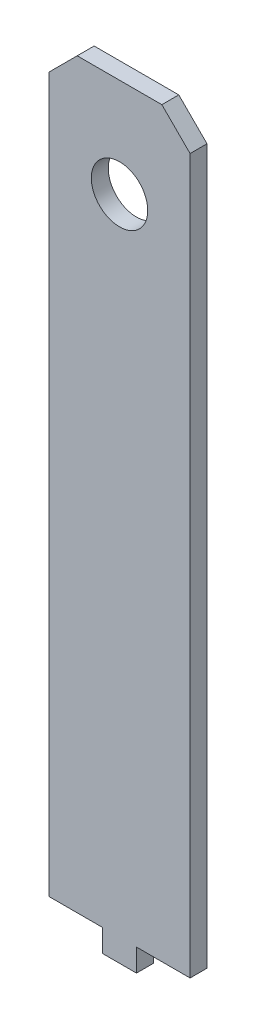
ISO-10303-21;
HEADER;
FILE_DESCRIPTION(('STEP AP214'),'2;1');
FILE_NAME('part.step','',(''),(''),'','','');
FILE_SCHEMA(('AUTOMOTIVE_DESIGN { 1 0 10303 214 1 1 1 1 }'));
ENDSEC;
DATA;
#1=APPLICATION_CONTEXT('core data for automotive mechanical design processes');
#2=APPLICATION_PROTOCOL_DEFINITION('international standard','automotive_design',2000,#1);
#3=PRODUCT_CONTEXT('',#1,'mechanical');
#4=PRODUCT('Part','Part','',(#3));
#5=PRODUCT_RELATED_PRODUCT_CATEGORY('part','',(#4));
#6=PRODUCT_DEFINITION_FORMATION('','',#4);
#7=PRODUCT_DEFINITION_CONTEXT('part definition',#1,'design');
#8=PRODUCT_DEFINITION('design','',#6,#7);
#9=PRODUCT_DEFINITION_SHAPE('','',#8);
#10=(LENGTH_UNIT() NAMED_UNIT(*) SI_UNIT(.MILLI.,.METRE.));
#11=(NAMED_UNIT(*) PLANE_ANGLE_UNIT() SI_UNIT($,.RADIAN.));
#12=(NAMED_UNIT(*) SI_UNIT($,.STERADIAN.) SOLID_ANGLE_UNIT());
#13=UNCERTAINTY_MEASURE_WITH_UNIT(LENGTH_MEASURE(1.E-05),#10,'distance_accuracy_value','');
#14=(GEOMETRIC_REPRESENTATION_CONTEXT(3) GLOBAL_UNCERTAINTY_ASSIGNED_CONTEXT((#13)) GLOBAL_UNIT_ASSIGNED_CONTEXT((#10,
#11,#12)) REPRESENTATION_CONTEXT('',''));
#15=CARTESIAN_POINT('',(0.,0.,0.));
#16=DIRECTION('',(0.,0.,1.));
#17=DIRECTION('',(1.,0.,0.));
#18=AXIS2_PLACEMENT_3D('',#15,#16,#17);
#19=CARTESIAN_POINT('',(12.5,0.,1.5));
#20=DIRECTION('',(-1.,0.,0.));
#21=DIRECTION('',(0.,0.,1.));
#22=AXIS2_PLACEMENT_3D('',#19,#20,#21);
#23=PLANE('',#22);
#24=DIRECTION('',(0.,1.,0.));
#25=VECTOR('',#24,1.);
#26=CARTESIAN_POINT('',(12.5,0.,1.5));
#27=LINE('',#26,#25);
#28=CARTESIAN_POINT('',(12.5,4.,1.5));
#29=VERTEX_POINT('',#28);
#30=CARTESIAN_POINT('',(12.5,130.5,1.5));
#31=VERTEX_POINT('',#30);
#32=EDGE_CURVE('E133',#29,#31,#27,.T.);
#33=ORIENTED_EDGE('',*,*,#32,.F.);
#34=DIRECTION('',(0.,0.,1.));
#35=VECTOR('',#34,1.);
#36=CARTESIAN_POINT('',(12.5,4.,-1.5));
#37=LINE('',#36,#35);
#38=CARTESIAN_POINT('',(12.5,4.,-1.5));
#39=VERTEX_POINT('',#38);
#40=EDGE_CURVE('E191',#39,#29,#37,.T.);
#41=ORIENTED_EDGE('',*,*,#40,.F.);
#42=DIRECTION('',(0.,1.,0.));
#43=VECTOR('',#42,1.);
#44=CARTESIAN_POINT('',(12.5,0.,-1.5));
#45=LINE('',#44,#43);
#46=CARTESIAN_POINT('',(12.5,130.5,-1.5));
#47=VERTEX_POINT('',#46);
#48=EDGE_CURVE('E178',#39,#47,#45,.T.);
#49=ORIENTED_EDGE('',*,*,#48,.T.);
#50=DIRECTION('',(0.,0.,1.));
#51=VECTOR('',#50,1.);
#52=CARTESIAN_POINT('',(12.5,130.5,1.5));
#53=LINE('',#52,#51);
#54=EDGE_CURVE('E153',#47,#31,#53,.T.);
#55=ORIENTED_EDGE('',*,*,#54,.T.);
#56=EDGE_LOOP('',(#33,#41,#49,#55));
#57=FACE_BOUND('',#56,.T.);
#58=ADVANCED_FACE('F34',(#57),#23,.F.);
#59=CARTESIAN_POINT('',(-12.5,135.5,1.5));
#60=DIRECTION('',(0.,-1.,0.));
#61=DIRECTION('',(0.,0.,-1.));
#62=AXIS2_PLACEMENT_3D('',#59,#60,#61);
#63=PLANE('',#62);
#64=DIRECTION('',(-1.,0.,0.));
#65=VECTOR('',#64,1.);
#66=CARTESIAN_POINT('',(-12.5,135.5,1.5));
#67=LINE('',#66,#65);
#68=CARTESIAN_POINT('',(7.49999999999998,135.5,1.5));
#69=VERTEX_POINT('',#68);
#70=CARTESIAN_POINT('',(-7.5,135.5,1.5));
#71=VERTEX_POINT('',#70);
#72=EDGE_CURVE('E136',#69,#71,#67,.T.);
#73=ORIENTED_EDGE('',*,*,#72,.F.);
#74=DIRECTION('',(0.,0.,-1.));
#75=VECTOR('',#74,1.);
#76=CARTESIAN_POINT('',(7.49999999999998,135.5,1.5));
#77=LINE('',#76,#75);
#78=CARTESIAN_POINT('',(7.49999999999998,135.5,-1.5));
#79=VERTEX_POINT('',#78);
#80=EDGE_CURVE('E145',#69,#79,#77,.T.);
#81=ORIENTED_EDGE('',*,*,#80,.T.);
#82=DIRECTION('',(-1.,0.,0.));
#83=VECTOR('',#82,1.);
#84=CARTESIAN_POINT('',(-12.5,135.5,-1.5));
#85=LINE('',#84,#83);
#86=CARTESIAN_POINT('',(-7.5,135.5,-1.5));
#87=VERTEX_POINT('',#86);
#88=EDGE_CURVE('E139',#79,#87,#85,.T.);
#89=ORIENTED_EDGE('',*,*,#88,.T.);
#90=DIRECTION('',(0.,0.,1.));
#91=VECTOR('',#90,1.);
#92=CARTESIAN_POINT('',(-7.5,135.5,1.5));
#93=LINE('',#92,#91);
#94=EDGE_CURVE('E143',#87,#71,#93,.T.);
#95=ORIENTED_EDGE('',*,*,#94,.T.);
#96=EDGE_LOOP('',(#73,#81,#89,#95));
#97=FACE_BOUND('',#96,.T.);
#98=ADVANCED_FACE('F170',(#97),#63,.F.);
#99=CARTESIAN_POINT('',(-12.5,0.,1.5));
#100=DIRECTION('',(1.,0.,0.));
#101=DIRECTION('',(0.,0.,-1.));
#102=AXIS2_PLACEMENT_3D('',#99,#100,#101);
#103=PLANE('',#102);
#104=DIRECTION('',(0.,-1.,0.));
#105=VECTOR('',#104,1.);
#106=CARTESIAN_POINT('',(-12.5,0.,-1.5));
#107=LINE('',#106,#105);
#108=CARTESIAN_POINT('',(-12.5,130.5,-1.5));
#109=VERTEX_POINT('',#108);
#110=CARTESIAN_POINT('',(-12.5,4.,-1.5));
#111=VERTEX_POINT('',#110);
#112=EDGE_CURVE('E134',#109,#111,#107,.T.);
#113=ORIENTED_EDGE('',*,*,#112,.T.);
#114=DIRECTION('',(0.,0.,1.));
#115=VECTOR('',#114,1.);
#116=CARTESIAN_POINT('',(-12.5,4.,-1.5));
#117=LINE('',#116,#115);
#118=CARTESIAN_POINT('',(-12.5,4.,1.5));
#119=VERTEX_POINT('',#118);
#120=EDGE_CURVE('E188',#111,#119,#117,.T.);
#121=ORIENTED_EDGE('',*,*,#120,.T.);
#122=DIRECTION('',(0.,-1.,0.));
#123=VECTOR('',#122,1.);
#124=CARTESIAN_POINT('',(-12.5,0.,1.5));
#125=LINE('',#124,#123);
#126=CARTESIAN_POINT('',(-12.5,130.5,1.5));
#127=VERTEX_POINT('',#126);
#128=EDGE_CURVE('E174',#127,#119,#125,.T.);
#129=ORIENTED_EDGE('',*,*,#128,.F.);
#130=DIRECTION('',(0.,0.,-1.));
#131=VECTOR('',#130,1.);
#132=CARTESIAN_POINT('',(-12.5,130.5,1.5));
#133=LINE('',#132,#131);
#134=EDGE_CURVE('E11',#127,#109,#133,.T.);
#135=ORIENTED_EDGE('',*,*,#134,.T.);
#136=EDGE_LOOP('',(#113,#121,#129,#135));
#137=FACE_BOUND('',#136,.T.);
#138=ADVANCED_FACE('F212',(#137),#103,.F.);
#139=CARTESIAN_POINT('',(12.5,0.,1.5));
#140=DIRECTION('',(0.,1.,0.));
#141=DIRECTION('',(0.,0.,1.));
#142=AXIS2_PLACEMENT_3D('',#139,#140,#141);
#143=PLANE('',#142);
#144=DIRECTION('',(1.,0.,0.));
#145=VECTOR('',#144,1.);
#146=CARTESIAN_POINT('',(12.5,0.,1.5));
#147=LINE('',#146,#145);
#148=CARTESIAN_POINT('',(-3.,0.,1.5));
#149=VERTEX_POINT('',#148);
#150=CARTESIAN_POINT('',(3.,0.,1.5));
#151=VERTEX_POINT('',#150);
#152=EDGE_CURVE('E128',#149,#151,#147,.T.);
#153=ORIENTED_EDGE('',*,*,#152,.F.);
#154=DIRECTION('',(0.,0.,1.));
#155=VECTOR('',#154,1.);
#156=CARTESIAN_POINT('',(-3.,0.,-1.5));
#157=LINE('',#156,#155);
#158=CARTESIAN_POINT('',(-3.,0.,-1.5));
#159=VERTEX_POINT('',#158);
#160=EDGE_CURVE('E114',#159,#149,#157,.T.);
#161=ORIENTED_EDGE('',*,*,#160,.F.);
#162=DIRECTION('',(1.,0.,0.));
#163=VECTOR('',#162,1.);
#164=CARTESIAN_POINT('',(12.5,0.,-1.5));
#165=LINE('',#164,#163);
#166=CARTESIAN_POINT('',(3.,0.,-1.5));
#167=VERTEX_POINT('',#166);
#168=EDGE_CURVE('E126',#159,#167,#165,.T.);
#169=ORIENTED_EDGE('',*,*,#168,.T.);
#170=DIRECTION('',(0.,0.,1.));
#171=VECTOR('',#170,1.);
#172=CARTESIAN_POINT('',(3.,0.,-1.5));
#173=LINE('',#172,#171);
#174=EDGE_CURVE('E195',#167,#151,#173,.T.);
#175=ORIENTED_EDGE('',*,*,#174,.T.);
#176=EDGE_LOOP('',(#153,#161,#169,#175));
#177=FACE_BOUND('',#176,.T.);
#178=ADVANCED_FACE('F124',(#177),#143,.F.);
#179=CARTESIAN_POINT('',(0.,0.,1.5));
#180=DIRECTION('',(0.,0.,-1.));
#181=DIRECTION('',(-1.,0.,0.));
#182=AXIS2_PLACEMENT_3D('',#179,#180,#181);
#183=PLANE('',#182);
#184=CARTESIAN_POINT('',(0.,118.,1.5));
#185=DIRECTION('',(0.,0.,1.));
#186=DIRECTION('',(1.,0.,0.));
#187=AXIS2_PLACEMENT_3D('',#184,#185,#186);
#188=CIRCLE('',#187,5.00000000000001);
#189=CARTESIAN_POINT('',(5.00000000000001,118.,1.5));
#190=VERTEX_POINT('',#189);
#191=EDGE_CURVE('E185',#190,#190,#188,.T.);
#192=ORIENTED_EDGE('',*,*,#191,.F.);
#193=EDGE_LOOP('',(#192));
#194=FACE_BOUND('',#193,.T.);
#195=ORIENTED_EDGE('',*,*,#128,.T.);
#196=DIRECTION('',(-1.,0.,0.));
#197=VECTOR('',#196,1.);
#198=CARTESIAN_POINT('',(-12.5,4.,1.5));
#199=LINE('',#198,#197);
#200=CARTESIAN_POINT('',(-3.,4.,1.5));
#201=VERTEX_POINT('',#200);
#202=EDGE_CURVE('E119',#201,#119,#199,.T.);
#203=ORIENTED_EDGE('',*,*,#202,.F.);
#204=DIRECTION('',(0.,1.,0.));
#205=VECTOR('',#204,1.);
#206=CARTESIAN_POINT('',(-3.,0.,1.5));
#207=LINE('',#206,#205);
#208=EDGE_CURVE('E197',#149,#201,#207,.T.);
#209=ORIENTED_EDGE('',*,*,#208,.F.);
#210=ORIENTED_EDGE('',*,*,#152,.T.);
#211=DIRECTION('',(0.,-1.,0.));
#212=VECTOR('',#211,1.);
#213=CARTESIAN_POINT('',(3.,0.,1.5));
#214=LINE('',#213,#212);
#215=CARTESIAN_POINT('',(3.,4.,1.5));
#216=VERTEX_POINT('',#215);
#217=EDGE_CURVE('E198',#216,#151,#214,.T.);
#218=ORIENTED_EDGE('',*,*,#217,.F.);
#219=DIRECTION('',(-1.,0.,0.));
#220=VECTOR('',#219,1.);
#221=CARTESIAN_POINT('',(12.5,4.,1.5));
#222=LINE('',#221,#220);
#223=EDGE_CURVE('E201',#29,#216,#222,.T.);
#224=ORIENTED_EDGE('',*,*,#223,.F.);
#225=ORIENTED_EDGE('',*,*,#32,.T.);
#226=DIRECTION('',(0.707106781186549,-0.707106781186547,0.));
#227=VECTOR('',#226,1.);
#228=CARTESIAN_POINT('',(7.49999999999998,135.5,1.5));
#229=LINE('',#228,#227);
#230=EDGE_CURVE('E42',#31,#69,#229,.F.);
#231=ORIENTED_EDGE('',*,*,#230,.T.);
#232=ORIENTED_EDGE('',*,*,#72,.T.);
#233=DIRECTION('',(0.707106781186551,0.707106781186544,0.));
#234=VECTOR('',#233,1.);
#235=CARTESIAN_POINT('',(-12.5,130.5,1.5));
#236=LINE('',#235,#234);
#237=EDGE_CURVE('E156',#71,#127,#236,.F.);
#238=ORIENTED_EDGE('',*,*,#237,.T.);
#239=EDGE_LOOP('',(#195,#203,#209,#210,#218,#224,#225,#231,#232,#238));
#240=FACE_BOUND('',#239,.T.);
#241=ADVANCED_FACE('F162',(#194,#240),#183,.F.);
#242=CARTESIAN_POINT('',(0.,0.,-1.5));
#243=DIRECTION('',(0.,0.,-1.));
#244=DIRECTION('',(-1.,0.,0.));
#245=AXIS2_PLACEMENT_3D('',#242,#243,#244);
#246=PLANE('',#245);
#247=DIRECTION('',(-1.,0.,0.));
#248=VECTOR('',#247,1.);
#249=CARTESIAN_POINT('',(-12.5,4.,-1.5));
#250=LINE('',#249,#248);
#251=CARTESIAN_POINT('',(-3.,4.,-1.5));
#252=VERTEX_POINT('',#251);
#253=EDGE_CURVE('E49',#252,#111,#250,.T.);
#254=ORIENTED_EDGE('',*,*,#253,.T.);
#255=ORIENTED_EDGE('',*,*,#112,.F.);
#256=DIRECTION('',(-0.707106781186551,-0.707106781186544,0.));
#257=VECTOR('',#256,1.);
#258=CARTESIAN_POINT('',(-71.5,71.5000000000008,-1.5));
#259=LINE('',#258,#257);
#260=EDGE_CURVE('E148',#109,#87,#259,.F.);
#261=ORIENTED_EDGE('',*,*,#260,.T.);
#262=ORIENTED_EDGE('',*,*,#88,.F.);
#263=DIRECTION('',(-0.707106781186549,0.707106781186547,0.));
#264=VECTOR('',#263,1.);
#265=CARTESIAN_POINT('',(71.5,71.5000000000002,-1.5));
#266=LINE('',#265,#264);
#267=EDGE_CURVE('E150',#79,#47,#266,.F.);
#268=ORIENTED_EDGE('',*,*,#267,.T.);
#269=ORIENTED_EDGE('',*,*,#48,.F.);
#270=DIRECTION('',(-1.,0.,0.));
#271=VECTOR('',#270,1.);
#272=CARTESIAN_POINT('',(12.5,4.,-1.5));
#273=LINE('',#272,#271);
#274=CARTESIAN_POINT('',(3.,4.,-1.5));
#275=VERTEX_POINT('',#274);
#276=EDGE_CURVE('E200',#39,#275,#273,.T.);
#277=ORIENTED_EDGE('',*,*,#276,.T.);
#278=DIRECTION('',(0.,-1.,0.));
#279=VECTOR('',#278,1.);
#280=CARTESIAN_POINT('',(3.,0.,-1.5));
#281=LINE('',#280,#279);
#282=EDGE_CURVE('E57',#275,#167,#281,.T.);
#283=ORIENTED_EDGE('',*,*,#282,.T.);
#284=ORIENTED_EDGE('',*,*,#168,.F.);
#285=DIRECTION('',(0.,1.,0.));
#286=VECTOR('',#285,1.);
#287=CARTESIAN_POINT('',(-3.,0.,-1.5));
#288=LINE('',#287,#286);
#289=EDGE_CURVE('E110',#159,#252,#288,.T.);
#290=ORIENTED_EDGE('',*,*,#289,.T.);
#291=EDGE_LOOP('',(#254,#255,#261,#262,#268,#269,#277,#283,#284,#290));
#292=FACE_BOUND('',#291,.T.);
#293=CARTESIAN_POINT('',(0.,118.,-1.5));
#294=DIRECTION('',(0.,0.,1.));
#295=DIRECTION('',(1.,0.,0.));
#296=AXIS2_PLACEMENT_3D('',#293,#294,#295);
#297=CIRCLE('',#296,5.00000000000001);
#298=CARTESIAN_POINT('',(5.00000000000001,118.,-1.5));
#299=VERTEX_POINT('',#298);
#300=EDGE_CURVE('E180',#299,#299,#297,.T.);
#301=ORIENTED_EDGE('',*,*,#300,.T.);
#302=EDGE_LOOP('',(#301));
#303=FACE_BOUND('',#302,.T.);
#304=ADVANCED_FACE('F130',(#292,#303),#246,.T.);
#305=CARTESIAN_POINT('',(0.,118.,-1.5));
#306=DIRECTION('',(0.,0.,1.));
#307=DIRECTION('',(1.,0.,0.));
#308=AXIS2_PLACEMENT_3D('',#305,#306,#307);
#309=CYLINDRICAL_SURFACE('',#308,5.00000000000001);
#310=ORIENTED_EDGE('',*,*,#300,.F.);
#311=EDGE_LOOP('',(#310));
#312=FACE_BOUND('',#311,.T.);
#313=ORIENTED_EDGE('',*,*,#191,.T.);
#314=EDGE_LOOP('',(#313));
#315=FACE_BOUND('',#314,.T.);
#316=ADVANCED_FACE('F238',(#312,#315),#309,.F.);
#317=CARTESIAN_POINT('',(7.49999999999998,135.5,1.5));
#318=DIRECTION('',(-0.707106781186547,-0.707106781186549,0.));
#319=DIRECTION('',(0.,0.,-1.));
#320=AXIS2_PLACEMENT_3D('',#317,#318,#319);
#321=PLANE('',#320);
#322=ORIENTED_EDGE('',*,*,#230,.F.);
#323=ORIENTED_EDGE('',*,*,#54,.F.);
#324=ORIENTED_EDGE('',*,*,#267,.F.);
#325=ORIENTED_EDGE('',*,*,#80,.F.);
#326=EDGE_LOOP('',(#322,#323,#324,#325));
#327=FACE_BOUND('',#326,.T.);
#328=ADVANCED_FACE('F176',(#327),#321,.F.);
#329=CARTESIAN_POINT('',(-12.5,130.5,1.5));
#330=DIRECTION('',(0.707106781186544,-0.707106781186551,0.));
#331=DIRECTION('',(0.,0.,-1.));
#332=AXIS2_PLACEMENT_3D('',#329,#330,#331);
#333=PLANE('',#332);
#334=ORIENTED_EDGE('',*,*,#237,.F.);
#335=ORIENTED_EDGE('',*,*,#94,.F.);
#336=ORIENTED_EDGE('',*,*,#260,.F.);
#337=ORIENTED_EDGE('',*,*,#134,.F.);
#338=EDGE_LOOP('',(#334,#335,#336,#337));
#339=FACE_BOUND('',#338,.T.);
#340=ADVANCED_FACE('F36',(#339),#333,.F.);
#341=CARTESIAN_POINT('',(3.,0.,-1.5));
#342=DIRECTION('',(-1.,0.,0.));
#343=DIRECTION('',(0.,-1.,0.));
#344=AXIS2_PLACEMENT_3D('',#341,#342,#343);
#345=PLANE('',#344);
#346=ORIENTED_EDGE('',*,*,#217,.T.);
#347=ORIENTED_EDGE('',*,*,#174,.F.);
#348=ORIENTED_EDGE('',*,*,#282,.F.);
#349=DIRECTION('',(0.,0.,1.));
#350=VECTOR('',#349,1.);
#351=CARTESIAN_POINT('',(3.,4.,-1.5));
#352=LINE('',#351,#350);
#353=EDGE_CURVE('E193',#275,#216,#352,.T.);
#354=ORIENTED_EDGE('',*,*,#353,.T.);
#355=EDGE_LOOP('',(#346,#347,#348,#354));
#356=FACE_BOUND('',#355,.T.);
#357=ADVANCED_FACE('F226',(#356),#345,.F.);
#358=CARTESIAN_POINT('',(12.5,4.,-1.5));
#359=DIRECTION('',(0.,1.,0.));
#360=DIRECTION('',(0.,0.,1.));
#361=AXIS2_PLACEMENT_3D('',#358,#359,#360);
#362=PLANE('',#361);
#363=ORIENTED_EDGE('',*,*,#223,.T.);
#364=ORIENTED_EDGE('',*,*,#353,.F.);
#365=ORIENTED_EDGE('',*,*,#276,.F.);
#366=ORIENTED_EDGE('',*,*,#40,.T.);
#367=EDGE_LOOP('',(#363,#364,#365,#366));
#368=FACE_BOUND('',#367,.T.);
#369=ADVANCED_FACE('F219',(#368),#362,.F.);
#370=CARTESIAN_POINT('',(-12.5,4.,-1.5));
#371=DIRECTION('',(0.,1.,0.));
#372=DIRECTION('',(0.,0.,1.));
#373=AXIS2_PLACEMENT_3D('',#370,#371,#372);
#374=PLANE('',#373);
#375=ORIENTED_EDGE('',*,*,#202,.T.);
#376=ORIENTED_EDGE('',*,*,#120,.F.);
#377=ORIENTED_EDGE('',*,*,#253,.F.);
#378=DIRECTION('',(0.,0.,1.));
#379=VECTOR('',#378,1.);
#380=CARTESIAN_POINT('',(-3.,4.,-1.5));
#381=LINE('',#380,#379);
#382=EDGE_CURVE('E116',#252,#201,#381,.T.);
#383=ORIENTED_EDGE('',*,*,#382,.T.);
#384=EDGE_LOOP('',(#375,#376,#377,#383));
#385=FACE_BOUND('',#384,.T.);
#386=ADVANCED_FACE('F217',(#385),#374,.F.);
#387=CARTESIAN_POINT('',(-3.,0.,-1.5));
#388=DIRECTION('',(1.,0.,0.));
#389=DIRECTION('',(0.,1.,0.));
#390=AXIS2_PLACEMENT_3D('',#387,#388,#389);
#391=PLANE('',#390);
#392=ORIENTED_EDGE('',*,*,#208,.T.);
#393=ORIENTED_EDGE('',*,*,#382,.F.);
#394=ORIENTED_EDGE('',*,*,#289,.F.);
#395=ORIENTED_EDGE('',*,*,#160,.T.);
#396=EDGE_LOOP('',(#392,#393,#394,#395));
#397=FACE_BOUND('',#396,.T.);
#398=ADVANCED_FACE('F113',(#397),#391,.F.);
#399=CLOSED_SHELL('',(#58,#98,#138,#178,#241,#304,#316,#328,#340,#357,#369,#386,#398));
#400=MANIFOLD_SOLID_BREP('B2',#399);
#401=ADVANCED_BREP_SHAPE_REPRESENTATION('',(#18,#400),#14);
#402=SHAPE_DEFINITION_REPRESENTATION(#9,#401);
ENDSEC;
END-ISO-10303-21;
